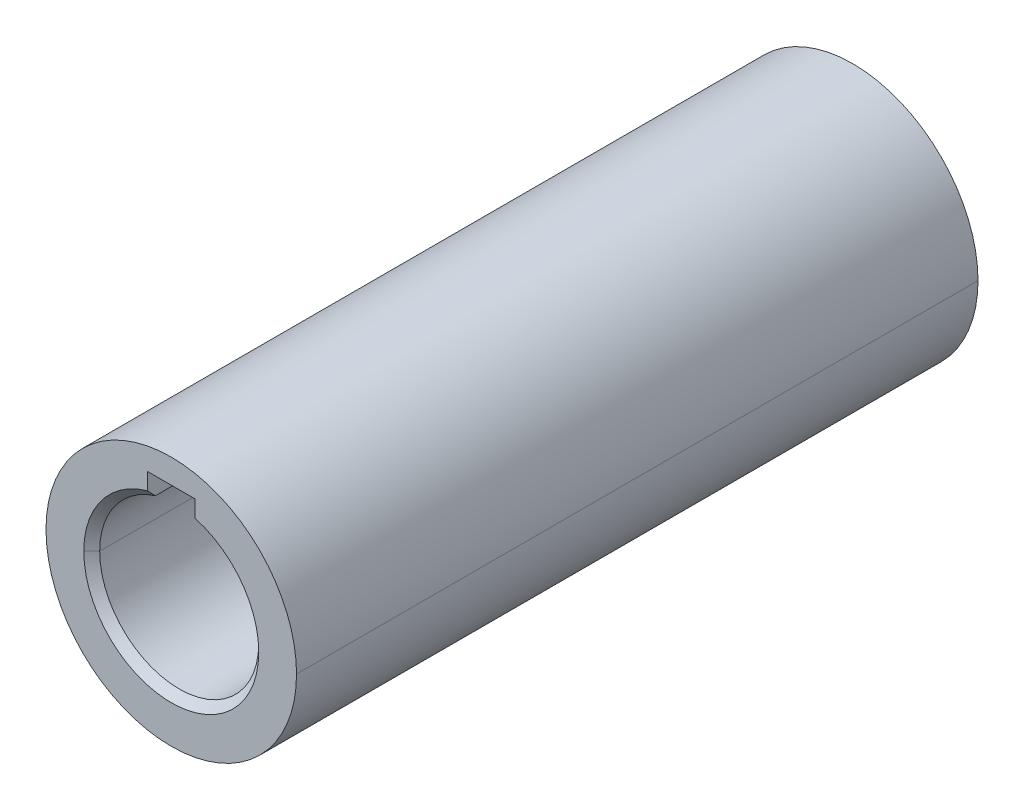
ISO-10303-21;
HEADER;
FILE_DESCRIPTION(('STEP AP214'),'2;1');
FILE_NAME('part.step','',(''),(''),'','','');
FILE_SCHEMA(('AUTOMOTIVE_DESIGN { 1 0 10303 214 1 1 1 1 }'));
ENDSEC;
DATA;
#1=APPLICATION_CONTEXT('core data for automotive mechanical design processes');
#2=APPLICATION_PROTOCOL_DEFINITION('international standard','automotive_design',2000,#1);
#3=PRODUCT_CONTEXT('',#1,'mechanical');
#4=PRODUCT('Part','Part','',(#3));
#5=PRODUCT_RELATED_PRODUCT_CATEGORY('part','',(#4));
#6=PRODUCT_DEFINITION_FORMATION('','',#4);
#7=PRODUCT_DEFINITION_CONTEXT('part definition',#1,'design');
#8=PRODUCT_DEFINITION('design','',#6,#7);
#9=PRODUCT_DEFINITION_SHAPE('','',#8);
#10=(LENGTH_UNIT() NAMED_UNIT(*) SI_UNIT(.MILLI.,.METRE.));
#11=(NAMED_UNIT(*) PLANE_ANGLE_UNIT() SI_UNIT($,.RADIAN.));
#12=(NAMED_UNIT(*) SI_UNIT($,.STERADIAN.) SOLID_ANGLE_UNIT());
#13=UNCERTAINTY_MEASURE_WITH_UNIT(LENGTH_MEASURE(1.E-05),#10,'distance_accuracy_value','');
#14=(GEOMETRIC_REPRESENTATION_CONTEXT(3) GLOBAL_UNCERTAINTY_ASSIGNED_CONTEXT((#13)) GLOBAL_UNIT_ASSIGNED_CONTEXT((#10,
#11,#12)) REPRESENTATION_CONTEXT('',''));
#15=CARTESIAN_POINT('',(0.,0.,0.));
#16=DIRECTION('',(0.,0.,1.));
#17=DIRECTION('',(1.,0.,0.));
#18=AXIS2_PLACEMENT_3D('',#15,#16,#17);
#19=CARTESIAN_POINT('',(0.,0.,33.20625));
#20=DIRECTION('',(0.,0.,1.));
#21=DIRECTION('',(1.,0.,0.));
#22=AXIS2_PLACEMENT_3D('',#19,#20,#21);
#23=CONICAL_SURFACE('',#22,7.9375,0.78539816339744);
#24=DIRECTION('',(-0.707106781186541,0.,0.707106781186554));
#25=VECTOR('',#24,1.);
#26=CARTESIAN_POINT('',(-7.9375,0.,33.20625));
#27=LINE('',#26,#25);
#28=CARTESIAN_POINT('',(-7.9375,0.,33.20625));
#29=VERTEX_POINT('',#28);
#30=CARTESIAN_POINT('',(-8.73125,0.,34.));
#31=VERTEX_POINT('',#30);
#32=EDGE_CURVE('E164',#29,#31,#27,.T.);
#33=ORIENTED_EDGE('',*,*,#32,.F.);
#34=CARTESIAN_POINT('',(0.,0.,33.20625));
#35=DIRECTION('',(0.,0.,1.));
#36=DIRECTION('',(1.,0.,0.));
#37=AXIS2_PLACEMENT_3D('',#34,#35,#36);
#38=CIRCLE('',#37,7.9375);
#39=CARTESIAN_POINT('',(-2.38125,7.57189241124701,33.20625));
#40=VERTEX_POINT('',#39);
#41=EDGE_CURVE('E22',#40,#29,#38,.T.);
#42=ORIENTED_EDGE('',*,*,#41,.F.);
#43=CARTESIAN_POINT('',(-2.38125,8.40026041263007,34.));
#44=CARTESIAN_POINT('',(-2.38125,8.12467273641111,33.7348594706656));
#45=CARTESIAN_POINT('',(-2.38125,7.84860466050566,33.4702166620801));
#46=CARTESIAN_POINT('',(-2.38125,7.57189241124701,33.20625));
#47=(BOUNDED_CURVE() B_SPLINE_CURVE(3,(#43,#44,#45,#46),.UNSPECIFIED.,.F.,
.F.) B_SPLINE_CURVE_WITH_KNOTS((4,4),(0.,0.00114727181095649),
.UNSPECIFIED.) CURVE() GEOMETRIC_REPRESENTATION_ITEM() RATIONAL_B_SPLINE_CURVE((1.,1.,1.,1.)) REPRESENTATION_ITEM(''));
#48=CARTESIAN_POINT('',(-2.38125,8.40026041263007,34.));
#49=VERTEX_POINT('',#48);
#50=EDGE_CURVE('E11',#49,#40,#47,.T.);
#51=ORIENTED_EDGE('',*,*,#50,.F.);
#52=CARTESIAN_POINT('',(0.,0.,34.));
#53=DIRECTION('',(0.,0.,-1.));
#54=DIRECTION('',(1.,0.,0.));
#55=AXIS2_PLACEMENT_3D('',#52,#53,#54);
#56=CIRCLE('',#55,8.73125);
#57=EDGE_CURVE('E174',#31,#49,#56,.T.);
#58=ORIENTED_EDGE('',*,*,#57,.F.);
#59=EDGE_LOOP('',(#33,#42,#51,#58));
#60=FACE_BOUND('',#59,.T.);
#61=ADVANCED_FACE('F18',(#60),#23,.F.);
#62=CARTESIAN_POINT('',(0.,0.,-34.));
#63=DIRECTION('',(0.,0.,-1.));
#64=DIRECTION('',(-1.,0.,0.));
#65=AXIS2_PLACEMENT_3D('',#62,#63,#64);
#66=CONICAL_SURFACE('',#65,8.73125,0.78539816339744);
#67=DIRECTION('',(0.707106781186542,0.,-0.707106781186554));
#68=VECTOR('',#67,1.);
#69=CARTESIAN_POINT('',(8.73125,0.,-34.));
#70=LINE('',#69,#68);
#71=CARTESIAN_POINT('',(7.9375,0.,-33.20625));
#72=VERTEX_POINT('',#71);
#73=CARTESIAN_POINT('',(8.73125,0.,-34.));
#74=VERTEX_POINT('',#73);
#75=EDGE_CURVE('E248',#72,#74,#70,.T.);
#76=ORIENTED_EDGE('',*,*,#75,.F.);
#77=CARTESIAN_POINT('',(0.,0.,-33.20625));
#78=DIRECTION('',(0.,0.,-1.));
#79=DIRECTION('',(1.,0.,0.));
#80=AXIS2_PLACEMENT_3D('',#77,#78,#79);
#81=CIRCLE('',#80,7.9375);
#82=CARTESIAN_POINT('',(2.38125,7.57189241124701,-33.20625));
#83=VERTEX_POINT('',#82);
#84=EDGE_CURVE('E128',#83,#72,#81,.T.);
#85=ORIENTED_EDGE('',*,*,#84,.F.);
#86=CARTESIAN_POINT('',(2.38125,8.40026041263006,-34.));
#87=CARTESIAN_POINT('',(2.38125,8.12467273641111,-33.7348594706656));
#88=CARTESIAN_POINT('',(2.38125,7.84860466050566,-33.4702166620801));
#89=CARTESIAN_POINT('',(2.38125,7.57189241124701,-33.20625));
#90=(BOUNDED_CURVE() B_SPLINE_CURVE(3,(#86,#87,#88,#89),.UNSPECIFIED.,.F.,
.F.) B_SPLINE_CURVE_WITH_KNOTS((4,4),(0.,0.00114727181095648),
.UNSPECIFIED.) CURVE() GEOMETRIC_REPRESENTATION_ITEM() RATIONAL_B_SPLINE_CURVE((1.,1.,1.,1.)) REPRESENTATION_ITEM(''));
#91=CARTESIAN_POINT('',(2.38125,8.40026041263006,-34.));
#92=VERTEX_POINT('',#91);
#93=EDGE_CURVE('E120',#92,#83,#90,.T.);
#94=ORIENTED_EDGE('',*,*,#93,.F.);
#95=CARTESIAN_POINT('',(0.,0.,-34.));
#96=DIRECTION('',(0.,0.,1.));
#97=DIRECTION('',(1.,0.,0.));
#98=AXIS2_PLACEMENT_3D('',#95,#96,#97);
#99=CIRCLE('',#98,8.73125);
#100=EDGE_CURVE('E125',#74,#92,#99,.T.);
#101=ORIENTED_EDGE('',*,*,#100,.F.);
#102=EDGE_LOOP('',(#76,#85,#94,#101));
#103=FACE_BOUND('',#102,.T.);
#104=ADVANCED_FACE('F123',(#103),#66,.F.);
#105=CARTESIAN_POINT('',(-2.38125,7.57189241124701,-34.));
#106=DIRECTION('',(1.,0.,0.));
#107=DIRECTION('',(0.,1.,0.));
#108=AXIS2_PLACEMENT_3D('',#105,#106,#107);
#109=PLANE('',#108);
#110=DIRECTION('',(0.,0.,1.));
#111=VECTOR('',#110,1.);
#112=CARTESIAN_POINT('',(-2.38125,7.57189241124701,-34.));
#113=LINE('',#112,#111);
#114=CARTESIAN_POINT('',(-2.38125,7.57189241124701,-33.20625));
#115=VERTEX_POINT('',#114);
#116=EDGE_CURVE('E132',#115,#40,#113,.T.);
#117=ORIENTED_EDGE('',*,*,#116,.F.);
#118=CARTESIAN_POINT('',(-2.38125,7.57189241124701,-33.20625));
#119=CARTESIAN_POINT('',(-2.38125,7.84860466050566,-33.4702166620801));
#120=CARTESIAN_POINT('',(-2.38125,8.1246727364111,-33.7348594706656));
#121=CARTESIAN_POINT('',(-2.38125,8.40026041263007,-34.));
#122=(BOUNDED_CURVE() B_SPLINE_CURVE(3,(#118,#119,#120,#121),.UNSPECIFIED.,.F.,
.F.) B_SPLINE_CURVE_WITH_KNOTS((4,4),(0.,0.00114727181095648),
.UNSPECIFIED.) CURVE() GEOMETRIC_REPRESENTATION_ITEM() RATIONAL_B_SPLINE_CURVE((1.,1.,1.,1.)) REPRESENTATION_ITEM(''));
#123=CARTESIAN_POINT('',(-2.38125,8.40026041263007,-34.));
#124=VERTEX_POINT('',#123);
#125=EDGE_CURVE('E184',#115,#124,#122,.T.);
#126=ORIENTED_EDGE('',*,*,#125,.T.);
#127=DIRECTION('',(0.,1.,0.));
#128=VECTOR('',#127,1.);
#129=CARTESIAN_POINT('',(-2.38125,7.57189241124701,-34.));
#130=LINE('',#129,#128);
#131=CARTESIAN_POINT('',(-2.38125,10.0711,-34.));
#132=VERTEX_POINT('',#131);
#133=EDGE_CURVE('E151',#124,#132,#130,.T.);
#134=ORIENTED_EDGE('',*,*,#133,.T.);
#135=DIRECTION('',(0.,0.,1.));
#136=VECTOR('',#135,1.);
#137=CARTESIAN_POINT('',(-2.38125,10.0711,-34.));
#138=LINE('',#137,#136);
#139=CARTESIAN_POINT('',(-2.38125,10.0711,34.));
#140=VERTEX_POINT('',#139);
#141=EDGE_CURVE('E213',#132,#140,#138,.T.);
#142=ORIENTED_EDGE('',*,*,#141,.T.);
#143=DIRECTION('',(0.,1.,0.));
#144=VECTOR('',#143,1.);
#145=CARTESIAN_POINT('',(-2.38125,7.57189241124701,34.));
#146=LINE('',#145,#144);
#147=EDGE_CURVE('E170',#49,#140,#146,.T.);
#148=ORIENTED_EDGE('',*,*,#147,.F.);
#149=ORIENTED_EDGE('',*,*,#50,.T.);
#150=EDGE_LOOP('',(#117,#126,#134,#142,#148,#149));
#151=FACE_BOUND('',#150,.T.);
#152=ADVANCED_FACE('F363',(#151),#109,.T.);
#153=CARTESIAN_POINT('',(0.,0.,-34.));
#154=DIRECTION('',(0.,0.,1.));
#155=DIRECTION('',(1.,0.,0.));
#156=AXIS2_PLACEMENT_3D('',#153,#154,#155);
#157=CYLINDRICAL_SURFACE('',#156,7.9375);
#158=DIRECTION('',(0.,0.,1.));
#159=VECTOR('',#158,1.);
#160=CARTESIAN_POINT('',(-7.9375,0.,-34.));
#161=LINE('',#160,#159);
#162=CARTESIAN_POINT('',(-7.9375,0.,-33.20625));
#163=VERTEX_POINT('',#162);
#164=EDGE_CURVE('E179',#163,#29,#161,.T.);
#165=ORIENTED_EDGE('',*,*,#164,.F.);
#166=CARTESIAN_POINT('',(0.,0.,-33.20625));
#167=DIRECTION('',(0.,0.,-1.));
#168=DIRECTION('',(1.,0.,0.));
#169=AXIS2_PLACEMENT_3D('',#166,#167,#168);
#170=CIRCLE('',#169,7.9375);
#171=EDGE_CURVE('E194',#163,#115,#170,.T.);
#172=ORIENTED_EDGE('',*,*,#171,.T.);
#173=ORIENTED_EDGE('',*,*,#116,.T.);
#174=ORIENTED_EDGE('',*,*,#41,.T.);
#175=EDGE_LOOP('',(#165,#172,#173,#174));
#176=FACE_BOUND('',#175,.T.);
#177=ADVANCED_FACE('F337',(#176),#157,.F.);
#178=CARTESIAN_POINT('',(2.38125,10.0711,-34.));
#179=DIRECTION('',(-1.,0.,0.));
#180=DIRECTION('',(0.,1.,0.));
#181=AXIS2_PLACEMENT_3D('',#178,#179,#180);
#182=PLANE('',#181);
#183=DIRECTION('',(0.,-1.,0.));
#184=VECTOR('',#183,1.);
#185=CARTESIAN_POINT('',(2.38125,10.0711,-34.));
#186=LINE('',#185,#184);
#187=CARTESIAN_POINT('',(2.38125,10.0711,-34.));
#188=VERTEX_POINT('',#187);
#189=EDGE_CURVE('E136',#188,#92,#186,.T.);
#190=ORIENTED_EDGE('',*,*,#189,.T.);
#191=ORIENTED_EDGE('',*,*,#93,.T.);
#192=DIRECTION('',(0.,0.,1.));
#193=VECTOR('',#192,1.);
#194=CARTESIAN_POINT('',(2.38125,7.57189241124701,-34.));
#195=LINE('',#194,#193);
#196=CARTESIAN_POINT('',(2.38125,7.57189241124701,33.20625));
#197=VERTEX_POINT('',#196);
#198=EDGE_CURVE('E162',#83,#197,#195,.T.);
#199=ORIENTED_EDGE('',*,*,#198,.T.);
#200=CARTESIAN_POINT('',(2.38125,7.57189241124701,33.20625));
#201=CARTESIAN_POINT('',(2.38125,7.84860466050566,33.4702166620801));
#202=CARTESIAN_POINT('',(2.38125,8.12467273641111,33.7348594706656));
#203=CARTESIAN_POINT('',(2.38125,8.40026041263007,34.));
#204=(BOUNDED_CURVE() B_SPLINE_CURVE(3,(#200,#201,#202,#203),.UNSPECIFIED.,.F.,
.F.) B_SPLINE_CURVE_WITH_KNOTS((4,4),(0.,0.00114727181095649),
.UNSPECIFIED.) CURVE() GEOMETRIC_REPRESENTATION_ITEM() RATIONAL_B_SPLINE_CURVE((1.,1.,1.,1.)) REPRESENTATION_ITEM(''));
#205=CARTESIAN_POINT('',(2.38125,8.40026041263007,34.));
#206=VERTEX_POINT('',#205);
#207=EDGE_CURVE('E243',#197,#206,#204,.T.);
#208=ORIENTED_EDGE('',*,*,#207,.T.);
#209=DIRECTION('',(0.,-1.,0.));
#210=VECTOR('',#209,1.);
#211=CARTESIAN_POINT('',(2.38125,10.0711,34.));
#212=LINE('',#211,#210);
#213=CARTESIAN_POINT('',(2.38125,10.0711,34.));
#214=VERTEX_POINT('',#213);
#215=EDGE_CURVE('E177',#214,#206,#212,.T.);
#216=ORIENTED_EDGE('',*,*,#215,.F.);
#217=DIRECTION('',(0.,0.,1.));
#218=VECTOR('',#217,1.);
#219=CARTESIAN_POINT('',(2.38125,10.0711,-34.));
#220=LINE('',#219,#218);
#221=EDGE_CURVE('E133',#188,#214,#220,.T.);
#222=ORIENTED_EDGE('',*,*,#221,.F.);
#223=EDGE_LOOP('',(#190,#191,#199,#208,#216,#222));
#224=FACE_BOUND('',#223,.T.);
#225=ADVANCED_FACE('F137',(#224),#182,.T.);
#226=CARTESIAN_POINT('',(2.38125,10.0711,-34.));
#227=DIRECTION('',(0.,1.,0.));
#228=DIRECTION('',(1.,0.,0.));
#229=AXIS2_PLACEMENT_3D('',#226,#227,#228);
#230=PLANE('',#229);
#231=DIRECTION('',(-1.,0.,0.));
#232=VECTOR('',#231,1.);
#233=CARTESIAN_POINT('',(2.38125,10.0711,34.));
#234=LINE('',#233,#232);
#235=EDGE_CURVE('E158',#214,#140,#234,.T.);
#236=ORIENTED_EDGE('',*,*,#235,.T.);
#237=ORIENTED_EDGE('',*,*,#141,.F.);
#238=DIRECTION('',(-1.,0.,0.));
#239=VECTOR('',#238,1.);
#240=CARTESIAN_POINT('',(2.38125,10.0711,-34.));
#241=LINE('',#240,#239);
#242=EDGE_CURVE('E143',#188,#132,#241,.T.);
#243=ORIENTED_EDGE('',*,*,#242,.F.);
#244=ORIENTED_EDGE('',*,*,#221,.T.);
#245=EDGE_LOOP('',(#236,#237,#243,#244));
#246=FACE_BOUND('',#245,.T.);
#247=ADVANCED_FACE('F374',(#246),#230,.F.);
#248=CARTESIAN_POINT('',(0.,0.,-34.));
#249=DIRECTION('',(0.,0.,1.));
#250=DIRECTION('',(1.,0.,0.));
#251=AXIS2_PLACEMENT_3D('',#248,#249,#250);
#252=PLANE('',#251);
#253=ORIENTED_EDGE('',*,*,#133,.F.);
#254=CARTESIAN_POINT('',(0.,0.,-34.));
#255=DIRECTION('',(0.,0.,1.));
#256=DIRECTION('',(1.,0.,0.));
#257=AXIS2_PLACEMENT_3D('',#254,#255,#256);
#258=CIRCLE('',#257,8.73125);
#259=CARTESIAN_POINT('',(-8.73125,0.,-34.));
#260=VERTEX_POINT('',#259);
#261=EDGE_CURVE('E198',#124,#260,#258,.T.);
#262=ORIENTED_EDGE('',*,*,#261,.T.);
#263=CARTESIAN_POINT('',(0.,0.,-34.));
#264=DIRECTION('',(0.,0.,1.));
#265=DIRECTION('',(1.,0.,0.));
#266=AXIS2_PLACEMENT_3D('',#263,#264,#265);
#267=CIRCLE('',#266,8.73125);
#268=EDGE_CURVE('E148',#260,#74,#267,.T.);
#269=ORIENTED_EDGE('',*,*,#268,.T.);
#270=ORIENTED_EDGE('',*,*,#100,.T.);
#271=ORIENTED_EDGE('',*,*,#189,.F.);
#272=ORIENTED_EDGE('',*,*,#242,.T.);
#273=EDGE_LOOP('',(#253,#262,#269,#270,#271,#272));
#274=FACE_BOUND('',#273,.T.);
#275=CARTESIAN_POINT('',(0.,0.,-34.));
#276=DIRECTION('',(0.,0.,1.));
#277=DIRECTION('',(1.,0.,0.));
#278=AXIS2_PLACEMENT_3D('',#275,#276,#277);
#279=CIRCLE('',#278,12.5);
#280=CARTESIAN_POINT('',(-12.5,0.,-34.));
#281=VERTEX_POINT('',#280);
#282=CARTESIAN_POINT('',(12.5,0.,-34.));
#283=VERTEX_POINT('',#282);
#284=EDGE_CURVE('E100',#281,#283,#279,.T.);
#285=ORIENTED_EDGE('',*,*,#284,.F.);
#286=CARTESIAN_POINT('',(0.,0.,-34.));
#287=DIRECTION('',(0.,0.,1.));
#288=DIRECTION('',(1.,0.,0.));
#289=AXIS2_PLACEMENT_3D('',#286,#287,#288);
#290=CIRCLE('',#289,12.5);
#291=EDGE_CURVE('E218',#283,#281,#290,.T.);
#292=ORIENTED_EDGE('',*,*,#291,.F.);
#293=EDGE_LOOP('',(#285,#292));
#294=FACE_BOUND('',#293,.T.);
#295=ADVANCED_FACE('F146',(#274,#294),#252,.F.);
#296=CARTESIAN_POINT('',(0.,0.,34.));
#297=DIRECTION('',(0.,0.,1.));
#298=DIRECTION('',(1.,0.,0.));
#299=AXIS2_PLACEMENT_3D('',#296,#297,#298);
#300=PLANE('',#299);
#301=ORIENTED_EDGE('',*,*,#215,.T.);
#302=CARTESIAN_POINT('',(0.,0.,34.));
#303=DIRECTION('',(0.,0.,-1.));
#304=DIRECTION('',(1.,0.,0.));
#305=AXIS2_PLACEMENT_3D('',#302,#303,#304);
#306=CIRCLE('',#305,8.73125);
#307=CARTESIAN_POINT('',(8.73125,0.,34.));
#308=VERTEX_POINT('',#307);
#309=EDGE_CURVE('E239',#206,#308,#306,.T.);
#310=ORIENTED_EDGE('',*,*,#309,.T.);
#311=CARTESIAN_POINT('',(0.,0.,34.));
#312=DIRECTION('',(0.,0.,-1.));
#313=DIRECTION('',(1.,0.,0.));
#314=AXIS2_PLACEMENT_3D('',#311,#312,#313);
#315=CIRCLE('',#314,8.73125);
#316=EDGE_CURVE('E168',#308,#31,#315,.T.);
#317=ORIENTED_EDGE('',*,*,#316,.T.);
#318=ORIENTED_EDGE('',*,*,#57,.T.);
#319=ORIENTED_EDGE('',*,*,#147,.T.);
#320=ORIENTED_EDGE('',*,*,#235,.F.);
#321=EDGE_LOOP('',(#301,#310,#317,#318,#319,#320));
#322=FACE_BOUND('',#321,.T.);
#323=CARTESIAN_POINT('',(0.,0.,34.));
#324=DIRECTION('',(0.,0.,1.));
#325=DIRECTION('',(1.,0.,0.));
#326=AXIS2_PLACEMENT_3D('',#323,#324,#325);
#327=CIRCLE('',#326,12.5);
#328=CARTESIAN_POINT('',(-12.5,0.,34.));
#329=VERTEX_POINT('',#328);
#330=CARTESIAN_POINT('',(12.5,0.,34.));
#331=VERTEX_POINT('',#330);
#332=EDGE_CURVE('E178',#329,#331,#327,.T.);
#333=ORIENTED_EDGE('',*,*,#332,.T.);
#334=CARTESIAN_POINT('',(0.,0.,34.));
#335=DIRECTION('',(0.,0.,1.));
#336=DIRECTION('',(1.,0.,0.));
#337=AXIS2_PLACEMENT_3D('',#334,#335,#336);
#338=CIRCLE('',#337,12.5);
#339=EDGE_CURVE('E219',#331,#329,#338,.T.);
#340=ORIENTED_EDGE('',*,*,#339,.T.);
#341=EDGE_LOOP('',(#333,#340));
#342=FACE_BOUND('',#341,.T.);
#343=ADVANCED_FACE('F297',(#322,#342),#300,.T.);
#344=CARTESIAN_POINT('',(0.,0.,34.));
#345=DIRECTION('',(0.,0.,-1.));
#346=DIRECTION('',(-1.,0.,0.));
#347=AXIS2_PLACEMENT_3D('',#344,#345,#346);
#348=CYLINDRICAL_SURFACE('',#347,12.5);
#349=DIRECTION('',(0.,0.,-1.));
#350=VECTOR('',#349,1.);
#351=CARTESIAN_POINT('',(12.5,0.,34.));
#352=LINE('',#351,#350);
#353=EDGE_CURVE('E214',#331,#283,#352,.T.);
#354=ORIENTED_EDGE('',*,*,#353,.F.);
#355=ORIENTED_EDGE('',*,*,#332,.F.);
#356=DIRECTION('',(0.,0.,-1.));
#357=VECTOR('',#356,1.);
#358=CARTESIAN_POINT('',(-12.5,0.,34.));
#359=LINE('',#358,#357);
#360=EDGE_CURVE('E210',#329,#281,#359,.T.);
#361=ORIENTED_EDGE('',*,*,#360,.T.);
#362=ORIENTED_EDGE('',*,*,#284,.T.);
#363=EDGE_LOOP('',(#354,#355,#361,#362));
#364=FACE_BOUND('',#363,.T.);
#365=ADVANCED_FACE('F367',(#364),#348,.T.);
#366=CARTESIAN_POINT('',(0.,0.,34.));
#367=DIRECTION('',(0.,0.,-1.));
#368=DIRECTION('',(-1.,0.,0.));
#369=AXIS2_PLACEMENT_3D('',#366,#367,#368);
#370=CYLINDRICAL_SURFACE('',#369,12.5);
#371=ORIENTED_EDGE('',*,*,#339,.F.);
#372=ORIENTED_EDGE('',*,*,#353,.T.);
#373=ORIENTED_EDGE('',*,*,#291,.T.);
#374=ORIENTED_EDGE('',*,*,#360,.F.);
#375=EDGE_LOOP('',(#371,#372,#373,#374));
#376=FACE_BOUND('',#375,.T.);
#377=ADVANCED_FACE('F356',(#376),#370,.T.);
#378=CARTESIAN_POINT('',(0.,0.,-34.));
#379=DIRECTION('',(0.,0.,1.));
#380=DIRECTION('',(1.,0.,0.));
#381=AXIS2_PLACEMENT_3D('',#378,#379,#380);
#382=CYLINDRICAL_SURFACE('',#381,7.9375);
#383=ORIENTED_EDGE('',*,*,#84,.T.);
#384=DIRECTION('',(0.,0.,1.));
#385=VECTOR('',#384,1.);
#386=CARTESIAN_POINT('',(7.9375,0.,-34.));
#387=LINE('',#386,#385);
#388=CARTESIAN_POINT('',(7.9375,0.,33.20625));
#389=VERTEX_POINT('',#388);
#390=EDGE_CURVE('E183',#72,#389,#387,.T.);
#391=ORIENTED_EDGE('',*,*,#390,.T.);
#392=CARTESIAN_POINT('',(0.,0.,33.20625));
#393=DIRECTION('',(0.,0.,1.));
#394=DIRECTION('',(1.,0.,0.));
#395=AXIS2_PLACEMENT_3D('',#392,#393,#394);
#396=CIRCLE('',#395,7.9375);
#397=EDGE_CURVE('E238',#389,#197,#396,.T.);
#398=ORIENTED_EDGE('',*,*,#397,.T.);
#399=ORIENTED_EDGE('',*,*,#198,.F.);
#400=EDGE_LOOP('',(#383,#391,#398,#399));
#401=FACE_BOUND('',#400,.T.);
#402=ADVANCED_FACE('F348',(#401),#382,.F.);
#403=CARTESIAN_POINT('',(0.,0.,-34.));
#404=DIRECTION('',(0.,0.,1.));
#405=DIRECTION('',(1.,0.,0.));
#406=AXIS2_PLACEMENT_3D('',#403,#404,#405);
#407=CYLINDRICAL_SURFACE('',#406,7.9375);
#408=CARTESIAN_POINT('',(0.,0.,-33.20625));
#409=DIRECTION('',(0.,0.,-1.));
#410=DIRECTION('',(1.,0.,0.));
#411=AXIS2_PLACEMENT_3D('',#408,#409,#410);
#412=CIRCLE('',#411,7.9375);
#413=EDGE_CURVE('E244',#72,#163,#412,.T.);
#414=ORIENTED_EDGE('',*,*,#413,.T.);
#415=ORIENTED_EDGE('',*,*,#164,.T.);
#416=CARTESIAN_POINT('',(0.,0.,33.20625));
#417=DIRECTION('',(0.,0.,1.));
#418=DIRECTION('',(1.,0.,0.));
#419=AXIS2_PLACEMENT_3D('',#416,#417,#418);
#420=CIRCLE('',#419,7.9375);
#421=EDGE_CURVE('E169',#29,#389,#420,.T.);
#422=ORIENTED_EDGE('',*,*,#421,.T.);
#423=ORIENTED_EDGE('',*,*,#390,.F.);
#424=EDGE_LOOP('',(#414,#415,#422,#423));
#425=FACE_BOUND('',#424,.T.);
#426=ADVANCED_FACE('F346',(#425),#407,.F.);
#427=CARTESIAN_POINT('',(0.,0.,-34.));
#428=DIRECTION('',(0.,0.,-1.));
#429=DIRECTION('',(-1.,0.,0.));
#430=AXIS2_PLACEMENT_3D('',#427,#428,#429);
#431=CONICAL_SURFACE('',#430,8.73125,0.78539816339744);
#432=ORIENTED_EDGE('',*,*,#171,.F.);
#433=DIRECTION('',(-0.707106781186542,0.,-0.707106781186554));
#434=VECTOR('',#433,1.);
#435=CARTESIAN_POINT('',(-8.73125,0.,-34.));
#436=LINE('',#435,#434);
#437=EDGE_CURVE('E190',#163,#260,#436,.T.);
#438=ORIENTED_EDGE('',*,*,#437,.T.);
#439=ORIENTED_EDGE('',*,*,#261,.F.);
#440=ORIENTED_EDGE('',*,*,#125,.F.);
#441=EDGE_LOOP('',(#432,#438,#439,#440));
#442=FACE_BOUND('',#441,.T.);
#443=ADVANCED_FACE('F342',(#442),#431,.F.);
#444=CARTESIAN_POINT('',(0.,0.,-34.));
#445=DIRECTION('',(0.,0.,-1.));
#446=DIRECTION('',(-1.,0.,0.));
#447=AXIS2_PLACEMENT_3D('',#444,#445,#446);
#448=CONICAL_SURFACE('',#447,8.73125,0.78539816339744);
#449=ORIENTED_EDGE('',*,*,#413,.F.);
#450=ORIENTED_EDGE('',*,*,#75,.T.);
#451=ORIENTED_EDGE('',*,*,#268,.F.);
#452=ORIENTED_EDGE('',*,*,#437,.F.);
#453=EDGE_LOOP('',(#449,#450,#451,#452));
#454=FACE_BOUND('',#453,.T.);
#455=ADVANCED_FACE('F20',(#454),#448,.F.);
#456=CARTESIAN_POINT('',(0.,0.,33.20625));
#457=DIRECTION('',(0.,0.,1.));
#458=DIRECTION('',(1.,0.,0.));
#459=AXIS2_PLACEMENT_3D('',#456,#457,#458);
#460=CONICAL_SURFACE('',#459,7.9375,0.78539816339744);
#461=ORIENTED_EDGE('',*,*,#397,.F.);
#462=DIRECTION('',(0.707106781186541,0.,0.707106781186554));
#463=VECTOR('',#462,1.);
#464=CARTESIAN_POINT('',(7.9375,0.,33.20625));
#465=LINE('',#464,#463);
#466=EDGE_CURVE('E234',#389,#308,#465,.T.);
#467=ORIENTED_EDGE('',*,*,#466,.T.);
#468=ORIENTED_EDGE('',*,*,#309,.F.);
#469=ORIENTED_EDGE('',*,*,#207,.F.);
#470=EDGE_LOOP('',(#461,#467,#468,#469));
#471=FACE_BOUND('',#470,.T.);
#472=ADVANCED_FACE('F381',(#471),#460,.F.);
#473=CARTESIAN_POINT('',(0.,0.,33.20625));
#474=DIRECTION('',(0.,0.,1.));
#475=DIRECTION('',(1.,0.,0.));
#476=AXIS2_PLACEMENT_3D('',#473,#474,#475);
#477=CONICAL_SURFACE('',#476,7.9375,0.78539816339744);
#478=ORIENTED_EDGE('',*,*,#421,.F.);
#479=ORIENTED_EDGE('',*,*,#32,.T.);
#480=ORIENTED_EDGE('',*,*,#316,.F.);
#481=ORIENTED_EDGE('',*,*,#466,.F.);
#482=EDGE_LOOP('',(#478,#479,#480,#481));
#483=FACE_BOUND('',#482,.T.);
#484=ADVANCED_FACE('F304',(#483),#477,.F.);
#485=CLOSED_SHELL('',(#61,#104,#152,#177,#225,#247,#295,#343,#365,#377,#402,#426,#443,#455,#472,#484));
#486=MANIFOLD_SOLID_BREP('B1',#485);
#487=ADVANCED_BREP_SHAPE_REPRESENTATION('',(#18,#486),#14);
#488=SHAPE_DEFINITION_REPRESENTATION(#9,#487);
ENDSEC;
END-ISO-10303-21;
